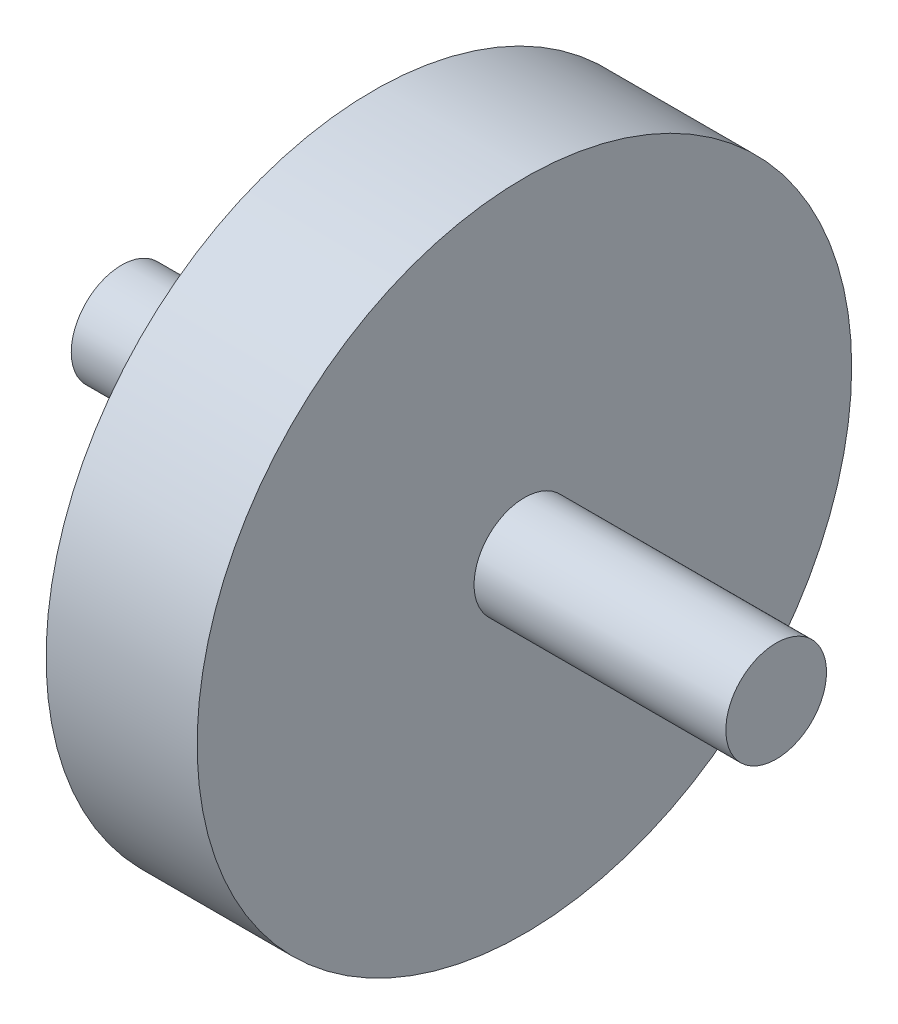
ISO-10303-21;
HEADER;
FILE_DESCRIPTION(('STEP AP214'),'2;1');
FILE_NAME('part.step','',(''),(''),'','','');
FILE_SCHEMA(('AUTOMOTIVE_DESIGN { 1 0 10303 214 1 1 1 1 }'));
ENDSEC;
DATA;
#1=APPLICATION_CONTEXT('core data for automotive mechanical design processes');
#2=APPLICATION_PROTOCOL_DEFINITION('international standard','automotive_design',2000,#1);
#3=PRODUCT_CONTEXT('',#1,'mechanical');
#4=PRODUCT('Part','Part','',(#3));
#5=PRODUCT_RELATED_PRODUCT_CATEGORY('part','',(#4));
#6=PRODUCT_DEFINITION_FORMATION('','',#4);
#7=PRODUCT_DEFINITION_CONTEXT('part definition',#1,'design');
#8=PRODUCT_DEFINITION('design','',#6,#7);
#9=PRODUCT_DEFINITION_SHAPE('','',#8);
#10=(LENGTH_UNIT() NAMED_UNIT(*) SI_UNIT(.MILLI.,.METRE.));
#11=(NAMED_UNIT(*) PLANE_ANGLE_UNIT() SI_UNIT($,.RADIAN.));
#12=(NAMED_UNIT(*) SI_UNIT($,.STERADIAN.) SOLID_ANGLE_UNIT());
#13=UNCERTAINTY_MEASURE_WITH_UNIT(LENGTH_MEASURE(1.E-05),#10,'distance_accuracy_value','');
#14=(GEOMETRIC_REPRESENTATION_CONTEXT(3) GLOBAL_UNCERTAINTY_ASSIGNED_CONTEXT((#13)) GLOBAL_UNIT_ASSIGNED_CONTEXT((#10,
#11,#12)) REPRESENTATION_CONTEXT('',''));
#15=CARTESIAN_POINT('',(0.,0.,0.));
#16=DIRECTION('',(0.,0.,1.));
#17=DIRECTION('',(1.,0.,0.));
#18=AXIS2_PLACEMENT_3D('',#15,#16,#17);
#19=CARTESIAN_POINT('',(30.,0.,0.));
#20=DIRECTION('',(-1.,0.,0.));
#21=DIRECTION('',(0.,0.,1.));
#22=AXIS2_PLACEMENT_3D('',#19,#20,#21);
#23=CYLINDRICAL_SURFACE('',#22,65.);
#24=CARTESIAN_POINT('',(30.,0.,0.));
#25=DIRECTION('',(1.,0.,0.));
#26=DIRECTION('',(0.,0.,-1.));
#27=AXIS2_PLACEMENT_3D('',#24,#25,#26);
#28=CIRCLE('',#27,65.);
#29=CARTESIAN_POINT('',(30.,0.,-65.));
#30=VERTEX_POINT('',#29);
#31=EDGE_CURVE('E51',#30,#30,#28,.T.);
#32=ORIENTED_EDGE('',*,*,#31,.F.);
#33=EDGE_LOOP('',(#32));
#34=FACE_BOUND('',#33,.T.);
#35=CARTESIAN_POINT('',(0.,0.,0.));
#36=DIRECTION('',(1.,0.,0.));
#37=DIRECTION('',(0.,0.,-1.));
#38=AXIS2_PLACEMENT_3D('',#35,#36,#37);
#39=CIRCLE('',#38,65.);
#40=CARTESIAN_POINT('',(0.,0.,-65.));
#41=VERTEX_POINT('',#40);
#42=EDGE_CURVE('E40',#41,#41,#39,.T.);
#43=ORIENTED_EDGE('',*,*,#42,.T.);
#44=EDGE_LOOP('',(#43));
#45=FACE_BOUND('',#44,.T.);
#46=ADVANCED_FACE('F37',(#34,#45),#23,.T.);
#47=CARTESIAN_POINT('',(30.,0.,0.));
#48=DIRECTION('',(1.,0.,0.));
#49=DIRECTION('',(0.,0.,-1.));
#50=AXIS2_PLACEMENT_3D('',#47,#48,#49);
#51=PLANE('',#50);
#52=CARTESIAN_POINT('',(30.,0.,0.));
#53=DIRECTION('',(1.,0.,0.));
#54=DIRECTION('',(0.,0.,-1.));
#55=AXIS2_PLACEMENT_3D('',#52,#53,#54);
#56=CIRCLE('',#55,10.);
#57=CARTESIAN_POINT('',(30.,0.,-10.));
#58=VERTEX_POINT('',#57);
#59=EDGE_CURVE('E45',#58,#58,#56,.T.);
#60=ORIENTED_EDGE('',*,*,#59,.F.);
#61=EDGE_LOOP('',(#60));
#62=FACE_BOUND('',#61,.T.);
#63=ORIENTED_EDGE('',*,*,#31,.T.);
#64=EDGE_LOOP('',(#63));
#65=FACE_BOUND('',#64,.T.);
#66=ADVANCED_FACE('F71',(#62,#65),#51,.T.);
#67=CARTESIAN_POINT('',(0.,0.,0.));
#68=DIRECTION('',(1.,0.,0.));
#69=DIRECTION('',(0.,0.,-1.));
#70=AXIS2_PLACEMENT_3D('',#67,#68,#69);
#71=PLANE('',#70);
#72=CARTESIAN_POINT('',(0.,0.,0.));
#73=DIRECTION('',(-1.,0.,0.));
#74=DIRECTION('',(0.,0.,1.));
#75=AXIS2_PLACEMENT_3D('',#72,#73,#74);
#76=CIRCLE('',#75,10.);
#77=CARTESIAN_POINT('',(0.,0.,10.));
#78=VERTEX_POINT('',#77);
#79=EDGE_CURVE('E10',#78,#78,#76,.T.);
#80=ORIENTED_EDGE('',*,*,#79,.F.);
#81=EDGE_LOOP('',(#80));
#82=FACE_BOUND('',#81,.T.);
#83=ORIENTED_EDGE('',*,*,#42,.F.);
#84=EDGE_LOOP('',(#83));
#85=FACE_BOUND('',#84,.T.);
#86=ADVANCED_FACE('F68',(#82,#85),#71,.F.);
#87=CARTESIAN_POINT('',(80.,0.,0.));
#88=DIRECTION('',(-1.,0.,0.));
#89=DIRECTION('',(0.,0.,1.));
#90=AXIS2_PLACEMENT_3D('',#87,#88,#89);
#91=CYLINDRICAL_SURFACE('',#90,10.);
#92=CARTESIAN_POINT('',(80.,0.,0.));
#93=DIRECTION('',(1.,0.,0.));
#94=DIRECTION('',(0.,0.,-1.));
#95=AXIS2_PLACEMENT_3D('',#92,#93,#94);
#96=CIRCLE('',#95,10.);
#97=CARTESIAN_POINT('',(80.,0.,-10.));
#98=VERTEX_POINT('',#97);
#99=EDGE_CURVE('E56',#98,#98,#96,.T.);
#100=ORIENTED_EDGE('',*,*,#99,.F.);
#101=EDGE_LOOP('',(#100));
#102=FACE_BOUND('',#101,.T.);
#103=ORIENTED_EDGE('',*,*,#59,.T.);
#104=EDGE_LOOP('',(#103));
#105=FACE_BOUND('',#104,.T.);
#106=ADVANCED_FACE('F70',(#102,#105),#91,.T.);
#107=CARTESIAN_POINT('',(80.,0.,0.));
#108=DIRECTION('',(1.,0.,0.));
#109=DIRECTION('',(0.,0.,-1.));
#110=AXIS2_PLACEMENT_3D('',#107,#108,#109);
#111=PLANE('',#110);
#112=ORIENTED_EDGE('',*,*,#99,.T.);
#113=EDGE_LOOP('',(#112));
#114=FACE_BOUND('',#113,.T.);
#115=ADVANCED_FACE('F77',(#114),#111,.T.);
#116=CARTESIAN_POINT('',(-50.,0.,0.));
#117=DIRECTION('',(1.,0.,0.));
#118=DIRECTION('',(0.,0.,-1.));
#119=AXIS2_PLACEMENT_3D('',#116,#117,#118);
#120=CYLINDRICAL_SURFACE('',#119,10.);
#121=CARTESIAN_POINT('',(-50.,0.,0.));
#122=DIRECTION('',(-1.,0.,0.));
#123=DIRECTION('',(0.,0.,1.));
#124=AXIS2_PLACEMENT_3D('',#121,#122,#123);
#125=CIRCLE('',#124,10.);
#126=CARTESIAN_POINT('',(-50.,0.,10.));
#127=VERTEX_POINT('',#126);
#128=EDGE_CURVE('E55',#127,#127,#125,.T.);
#129=ORIENTED_EDGE('',*,*,#128,.F.);
#130=EDGE_LOOP('',(#129));
#131=FACE_BOUND('',#130,.T.);
#132=ORIENTED_EDGE('',*,*,#79,.T.);
#133=EDGE_LOOP('',(#132));
#134=FACE_BOUND('',#133,.T.);
#135=ADVANCED_FACE('F105',(#131,#134),#120,.T.);
#136=CARTESIAN_POINT('',(-50.,0.,0.));
#137=DIRECTION('',(-1.,0.,0.));
#138=DIRECTION('',(0.,0.,1.));
#139=AXIS2_PLACEMENT_3D('',#136,#137,#138);
#140=PLANE('',#139);
#141=ORIENTED_EDGE('',*,*,#128,.T.);
#142=EDGE_LOOP('',(#141));
#143=FACE_BOUND('',#142,.T.);
#144=ADVANCED_FACE('F119',(#143),#140,.T.);
#145=CLOSED_SHELL('',(#46,#66,#86,#106,#115,#135,#144));
#146=MANIFOLD_SOLID_BREP('B2',#145);
#147=ADVANCED_BREP_SHAPE_REPRESENTATION('',(#18,#146),#14);
#148=SHAPE_DEFINITION_REPRESENTATION(#9,#147);
ENDSEC;
END-ISO-10303-21;
